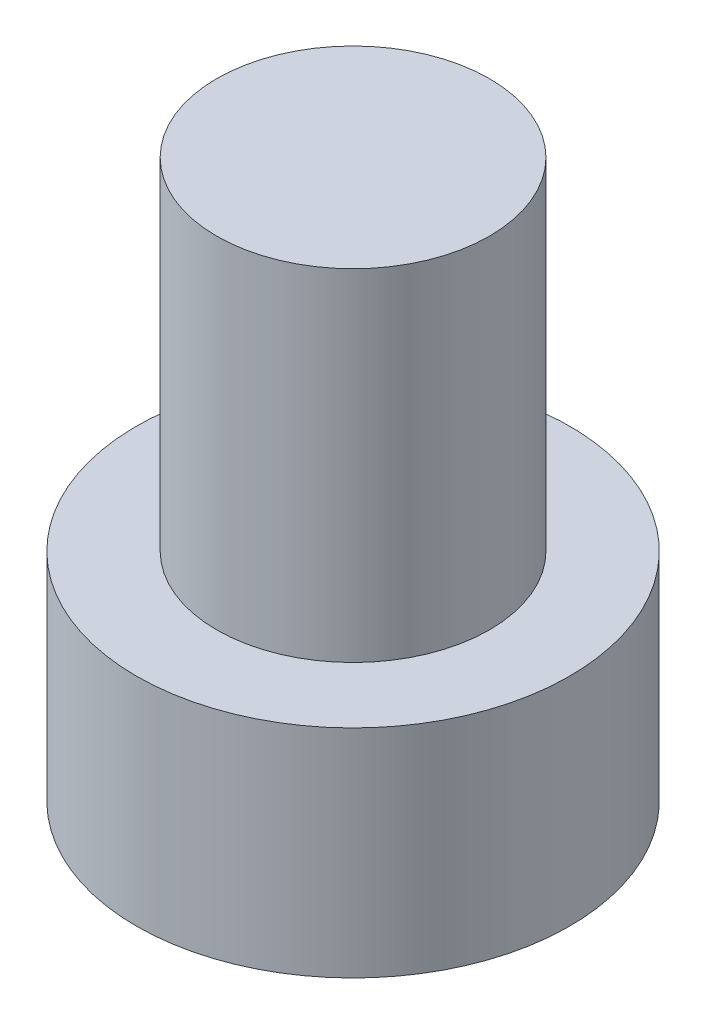
ISO-10303-21;
HEADER;
FILE_DESCRIPTION(('STEP AP214'),'2;1');
FILE_NAME('part.step','',(''),(''),'','','');
FILE_SCHEMA(('AUTOMOTIVE_DESIGN { 1 0 10303 214 1 1 1 1 }'));
ENDSEC;
DATA;
#1=APPLICATION_CONTEXT('core data for automotive mechanical design processes');
#2=APPLICATION_PROTOCOL_DEFINITION('international standard','automotive_design',2000,#1);
#3=PRODUCT_CONTEXT('',#1,'mechanical');
#4=PRODUCT('Part','Part','',(#3));
#5=PRODUCT_RELATED_PRODUCT_CATEGORY('part','',(#4));
#6=PRODUCT_DEFINITION_FORMATION('','',#4);
#7=PRODUCT_DEFINITION_CONTEXT('part definition',#1,'design');
#8=PRODUCT_DEFINITION('design','',#6,#7);
#9=PRODUCT_DEFINITION_SHAPE('','',#8);
#10=(LENGTH_UNIT() NAMED_UNIT(*) SI_UNIT(.MILLI.,.METRE.));
#11=(NAMED_UNIT(*) PLANE_ANGLE_UNIT() SI_UNIT($,.RADIAN.));
#12=(NAMED_UNIT(*) SI_UNIT($,.STERADIAN.) SOLID_ANGLE_UNIT());
#13=UNCERTAINTY_MEASURE_WITH_UNIT(LENGTH_MEASURE(1.E-05),#10,'distance_accuracy_value','');
#14=(GEOMETRIC_REPRESENTATION_CONTEXT(3) GLOBAL_UNCERTAINTY_ASSIGNED_CONTEXT((#13)) GLOBAL_UNIT_ASSIGNED_CONTEXT((#10,
#11,#12)) REPRESENTATION_CONTEXT('',''));
#15=CARTESIAN_POINT('',(0.,0.,0.));
#16=DIRECTION('',(0.,0.,1.));
#17=DIRECTION('',(1.,0.,0.));
#18=AXIS2_PLACEMENT_3D('',#15,#16,#17);
#19=CARTESIAN_POINT('',(0.,3.175,0.));
#20=DIRECTION('',(0.,-1.,0.));
#21=DIRECTION('',(0.,0.,-1.));
#22=AXIS2_PLACEMENT_3D('',#19,#20,#21);
#23=CYLINDRICAL_SURFACE('',#22,3.175);
#24=CARTESIAN_POINT('',(0.,3.175,0.));
#25=DIRECTION('',(0.,1.,0.));
#26=DIRECTION('',(0.,0.,1.));
#27=AXIS2_PLACEMENT_3D('',#24,#25,#26);
#28=CIRCLE('',#27,3.175);
#29=CARTESIAN_POINT('',(0.,3.175,3.175));
#30=VERTEX_POINT('',#29);
#31=EDGE_CURVE('E45',#30,#30,#28,.T.);
#32=ORIENTED_EDGE('',*,*,#31,.F.);
#33=EDGE_LOOP('',(#32));
#34=FACE_BOUND('',#33,.T.);
#35=CARTESIAN_POINT('',(0.,0.,0.));
#36=DIRECTION('',(0.,1.,0.));
#37=DIRECTION('',(0.,0.,1.));
#38=AXIS2_PLACEMENT_3D('',#35,#36,#37);
#39=CIRCLE('',#38,3.175);
#40=CARTESIAN_POINT('',(0.,0.,3.175));
#41=VERTEX_POINT('',#40);
#42=EDGE_CURVE('E40',#41,#41,#39,.T.);
#43=ORIENTED_EDGE('',*,*,#42,.T.);
#44=EDGE_LOOP('',(#43));
#45=FACE_BOUND('',#44,.T.);
#46=ADVANCED_FACE('F37',(#34,#45),#23,.T.);
#47=CARTESIAN_POINT('',(0.,3.175,0.));
#48=DIRECTION('',(0.,1.,0.));
#49=DIRECTION('',(0.,0.,1.));
#50=AXIS2_PLACEMENT_3D('',#47,#48,#49);
#51=PLANE('',#50);
#52=CARTESIAN_POINT('',(0.,3.175,0.));
#53=DIRECTION('',(0.,1.,0.));
#54=DIRECTION('',(0.,0.,1.));
#55=AXIS2_PLACEMENT_3D('',#52,#53,#54);
#56=CIRCLE('',#55,2.);
#57=CARTESIAN_POINT('',(0.,3.175,2.));
#58=VERTEX_POINT('',#57);
#59=EDGE_CURVE('E10',#58,#58,#56,.T.);
#60=ORIENTED_EDGE('',*,*,#59,.F.);
#61=EDGE_LOOP('',(#60));
#62=FACE_BOUND('',#61,.T.);
#63=ORIENTED_EDGE('',*,*,#31,.T.);
#64=EDGE_LOOP('',(#63));
#65=FACE_BOUND('',#64,.T.);
#66=ADVANCED_FACE('F65',(#62,#65),#51,.T.);
#67=CARTESIAN_POINT('',(0.,0.,0.));
#68=DIRECTION('',(0.,1.,0.));
#69=DIRECTION('',(0.,0.,1.));
#70=AXIS2_PLACEMENT_3D('',#67,#68,#69);
#71=PLANE('',#70);
#72=ORIENTED_EDGE('',*,*,#42,.F.);
#73=EDGE_LOOP('',(#72));
#74=FACE_BOUND('',#73,.T.);
#75=ADVANCED_FACE('F62',(#74),#71,.F.);
#76=CARTESIAN_POINT('',(0.,8.175,0.));
#77=DIRECTION('',(0.,-1.,0.));
#78=DIRECTION('',(0.,0.,-1.));
#79=AXIS2_PLACEMENT_3D('',#76,#77,#78);
#80=CYLINDRICAL_SURFACE('',#79,2.);
#81=CARTESIAN_POINT('',(0.,8.175,0.));
#82=DIRECTION('',(0.,1.,0.));
#83=DIRECTION('',(0.,0.,1.));
#84=AXIS2_PLACEMENT_3D('',#81,#82,#83);
#85=CIRCLE('',#84,2.);
#86=CARTESIAN_POINT('',(0.,8.175,2.));
#87=VERTEX_POINT('',#86);
#88=EDGE_CURVE('E52',#87,#87,#85,.T.);
#89=ORIENTED_EDGE('',*,*,#88,.F.);
#90=EDGE_LOOP('',(#89));
#91=FACE_BOUND('',#90,.T.);
#92=ORIENTED_EDGE('',*,*,#59,.T.);
#93=EDGE_LOOP('',(#92));
#94=FACE_BOUND('',#93,.T.);
#95=ADVANCED_FACE('F64',(#91,#94),#80,.T.);
#96=CARTESIAN_POINT('',(0.,8.175,0.));
#97=DIRECTION('',(0.,1.,0.));
#98=DIRECTION('',(0.,0.,1.));
#99=AXIS2_PLACEMENT_3D('',#96,#97,#98);
#100=PLANE('',#99);
#101=ORIENTED_EDGE('',*,*,#88,.T.);
#102=EDGE_LOOP('',(#101));
#103=FACE_BOUND('',#102,.T.);
#104=ADVANCED_FACE('F70',(#103),#100,.T.);
#105=CLOSED_SHELL('',(#46,#66,#75,#95,#104));
#106=MANIFOLD_SOLID_BREP('B2',#105);
#107=ADVANCED_BREP_SHAPE_REPRESENTATION('',(#18,#106),#14);
#108=SHAPE_DEFINITION_REPRESENTATION(#9,#107);
ENDSEC;
END-ISO-10303-21;
